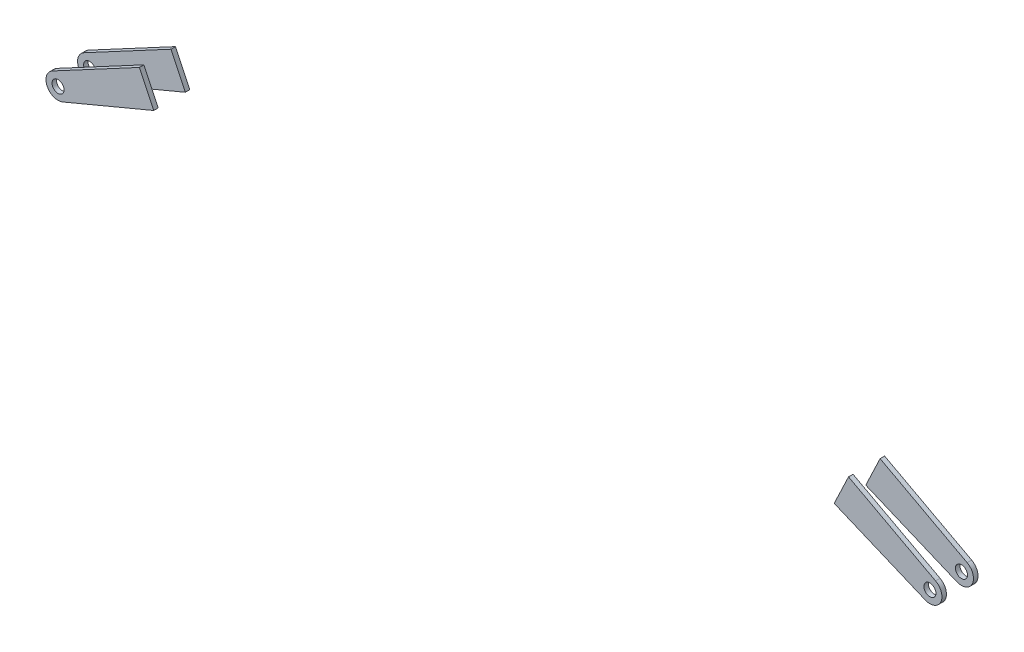
ISO-10303-21;
HEADER;
FILE_DESCRIPTION(('STEP AP214'),'2;1');
FILE_NAME('part.step','',(''),(''),'','','');
FILE_SCHEMA(('AUTOMOTIVE_DESIGN { 1 0 10303 214 1 1 1 1 }'));
ENDSEC;
DATA;
#1=APPLICATION_CONTEXT('core data for automotive mechanical design processes');
#2=APPLICATION_PROTOCOL_DEFINITION('international standard','automotive_design',2000,#1);
#3=PRODUCT_CONTEXT('',#1,'mechanical');
#4=PRODUCT('Part','Part','',(#3));
#5=PRODUCT_RELATED_PRODUCT_CATEGORY('part','',(#4));
#6=PRODUCT_DEFINITION_FORMATION('','',#4);
#7=PRODUCT_DEFINITION_CONTEXT('part definition',#1,'design');
#8=PRODUCT_DEFINITION('design','',#6,#7);
#9=PRODUCT_DEFINITION_SHAPE('','',#8);
#10=(LENGTH_UNIT() NAMED_UNIT(*) SI_UNIT(.MILLI.,.METRE.));
#11=(NAMED_UNIT(*) PLANE_ANGLE_UNIT() SI_UNIT($,.RADIAN.));
#12=(NAMED_UNIT(*) SI_UNIT($,.STERADIAN.) SOLID_ANGLE_UNIT());
#13=UNCERTAINTY_MEASURE_WITH_UNIT(LENGTH_MEASURE(1.E-05),#10,'distance_accuracy_value','');
#14=(GEOMETRIC_REPRESENTATION_CONTEXT(3) GLOBAL_UNCERTAINTY_ASSIGNED_CONTEXT((#13)) GLOBAL_UNIT_ASSIGNED_CONTEXT((#10,
#11,#12)) REPRESENTATION_CONTEXT('',''));
#15=CARTESIAN_POINT('',(0.,0.,0.));
#16=DIRECTION('',(0.,0.,1.));
#17=DIRECTION('',(1.,0.,0.));
#18=AXIS2_PLACEMENT_3D('',#15,#16,#17);
#19=CARTESIAN_POINT('',(0.,0.,152.999999999998));
#20=DIRECTION('',(0.,0.,1.));
#21=DIRECTION('',(1.,0.,0.));
#22=AXIS2_PLACEMENT_3D('',#19,#20,#21);
#23=PLANE('',#22);
#24=CARTESIAN_POINT('',(-290.,-1970.,152.999999999998));
#25=DIRECTION('',(0.,0.,-1.));
#26=DIRECTION('',(-1.,0.,0.));
#27=AXIS2_PLACEMENT_3D('',#24,#25,#26);
#28=CIRCLE('',#27,3.99999999999999);
#29=CARTESIAN_POINT('',(-294.,-1970.,152.999999999998));
#30=VERTEX_POINT('',#29);
#31=EDGE_CURVE('E146',#30,#30,#28,.T.);
#32=ORIENTED_EDGE('',*,*,#31,.F.);
#33=EDGE_LOOP('',(#32));
#34=FACE_BOUND('',#33,.T.);
#35=DIRECTION('',(-0.429568007773573,0.903034510247224,0.));
#36=VECTOR('',#35,1.);
#37=CARTESIAN_POINT('',(-226.339589967334,-1952.00640704133,152.999999999998));
#38=LINE('',#37,#36);
#39=CARTESIAN_POINT('',(-226.339589967334,-1952.00640704133,152.999999999998));
#40=VERTEX_POINT('',#39);
#41=CARTESIAN_POINT('',(-235.87397227063,-1931.96330304391,152.999999999998));
#42=VERTEX_POINT('',#41);
#43=EDGE_CURVE('E132',#40,#42,#38,.T.);
#44=ORIENTED_EDGE('',*,*,#43,.F.);
#45=DIRECTION('',(0.9223450065069,0.386367298010308,0.));
#46=VECTOR('',#45,1.);
#47=CARTESIAN_POINT('',(-286.909061615918,-1977.37876005206,152.999999999998));
#48=LINE('',#47,#46);
#49=CARTESIAN_POINT('',(-286.909061615918,-1977.37876005206,152.999999999998));
#50=VERTEX_POINT('',#49);
#51=EDGE_CURVE('E139',#50,#40,#48,.T.);
#52=ORIENTED_EDGE('',*,*,#51,.F.);
#53=CARTESIAN_POINT('',(-290.,-1970.,152.999999999998));
#54=DIRECTION('',(0.,0.,1.));
#55=DIRECTION('',(-1.,0.,0.));
#56=AXIS2_PLACEMENT_3D('',#53,#54,#55);
#57=CIRCLE('',#56,8.00000000000014);
#58=CARTESIAN_POINT('',(-293.77445464255,-1962.94638446247,152.999999999998));
#59=VERTEX_POINT('',#58);
#60=EDGE_CURVE('E161',#59,#50,#57,.T.);
#61=ORIENTED_EDGE('',*,*,#60,.F.);
#62=DIRECTION('',(-0.881701942191687,-0.47180683031873,0.));
#63=VECTOR('',#62,1.);
#64=CARTESIAN_POINT('',(-235.87397227063,-1931.96330304391,152.999999999998));
#65=LINE('',#64,#63);
#66=EDGE_CURVE('E96',#42,#59,#65,.T.);
#67=ORIENTED_EDGE('',*,*,#66,.F.);
#68=EDGE_LOOP('',(#44,#52,#61,#67));
#69=FACE_BOUND('',#68,.T.);
#70=ADVANCED_FACE('F87',(#34,#69),#23,.F.);
#71=CARTESIAN_POINT('',(0.,0.,155.999999999998));
#72=DIRECTION('',(0.,0.,1.));
#73=DIRECTION('',(1.,0.,0.));
#74=AXIS2_PLACEMENT_3D('',#71,#72,#73);
#75=PLANE('',#74);
#76=CARTESIAN_POINT('',(-290.,-1970.,155.999999999998));
#77=DIRECTION('',(0.,0.,-1.));
#78=DIRECTION('',(-1.,0.,0.));
#79=AXIS2_PLACEMENT_3D('',#76,#77,#78);
#80=CIRCLE('',#79,3.99999999999999);
#81=CARTESIAN_POINT('',(-294.,-1970.,155.999999999998));
#82=VERTEX_POINT('',#81);
#83=EDGE_CURVE('E149',#82,#82,#80,.T.);
#84=ORIENTED_EDGE('',*,*,#83,.T.);
#85=EDGE_LOOP('',(#84));
#86=FACE_BOUND('',#85,.T.);
#87=DIRECTION('',(-0.429568007773573,0.903034510247224,0.));
#88=VECTOR('',#87,1.);
#89=CARTESIAN_POINT('',(-226.339589967334,-1952.00640704133,155.999999999998));
#90=LINE('',#89,#88);
#91=CARTESIAN_POINT('',(-226.339589967334,-1952.00640704133,155.999999999998));
#92=VERTEX_POINT('',#91);
#93=CARTESIAN_POINT('',(-235.87397227063,-1931.96330304391,155.999999999998));
#94=VERTEX_POINT('',#93);
#95=EDGE_CURVE('E134',#92,#94,#90,.T.);
#96=ORIENTED_EDGE('',*,*,#95,.T.);
#97=DIRECTION('',(-0.881701942191687,-0.47180683031873,0.));
#98=VECTOR('',#97,1.);
#99=CARTESIAN_POINT('',(-235.87397227063,-1931.96330304391,155.999999999998));
#100=LINE('',#99,#98);
#101=CARTESIAN_POINT('',(-293.77445464255,-1962.94638446247,155.999999999998));
#102=VERTEX_POINT('',#101);
#103=EDGE_CURVE('E13',#94,#102,#100,.T.);
#104=ORIENTED_EDGE('',*,*,#103,.T.);
#105=CARTESIAN_POINT('',(-290.,-1970.,155.999999999998));
#106=DIRECTION('',(0.,0.,1.));
#107=DIRECTION('',(-1.,0.,0.));
#108=AXIS2_PLACEMENT_3D('',#105,#106,#107);
#109=CIRCLE('',#108,8.00000000000014);
#110=CARTESIAN_POINT('',(-286.909061615918,-1977.37876005206,155.999999999998));
#111=VERTEX_POINT('',#110);
#112=EDGE_CURVE('E158',#102,#111,#109,.T.);
#113=ORIENTED_EDGE('',*,*,#112,.T.);
#114=DIRECTION('',(0.9223450065069,0.386367298010308,0.));
#115=VECTOR('',#114,1.);
#116=CARTESIAN_POINT('',(-286.909061615918,-1977.37876005206,155.999999999998));
#117=LINE('',#116,#115);
#118=EDGE_CURVE('E163',#111,#92,#117,.T.);
#119=ORIENTED_EDGE('',*,*,#118,.T.);
#120=EDGE_LOOP('',(#96,#104,#113,#119));
#121=FACE_BOUND('',#120,.T.);
#122=ADVANCED_FACE('F175',(#86,#121),#75,.T.);
#123=CARTESIAN_POINT('',(-226.339589967334,-1952.00640704133,155.999999999998));
#124=DIRECTION('',(-0.903034510247224,-0.429568007773573,0.));
#125=DIRECTION('',(-0.429568007773573,0.903034510247224,0.));
#126=AXIS2_PLACEMENT_3D('',#123,#124,#125);
#127=PLANE('',#126);
#128=ORIENTED_EDGE('',*,*,#43,.T.);
#129=DIRECTION('',(0.,0.,-1.));
#130=VECTOR('',#129,1.);
#131=CARTESIAN_POINT('',(-235.87397227063,-1931.96330304391,155.999999999998));
#132=LINE('',#131,#130);
#133=EDGE_CURVE('E122',#94,#42,#132,.T.);
#134=ORIENTED_EDGE('',*,*,#133,.F.);
#135=ORIENTED_EDGE('',*,*,#95,.F.);
#136=DIRECTION('',(0.,0.,-1.));
#137=VECTOR('',#136,1.);
#138=CARTESIAN_POINT('',(-226.339589967334,-1952.00640704133,155.999999999998));
#139=LINE('',#138,#137);
#140=EDGE_CURVE('E128',#92,#40,#139,.T.);
#141=ORIENTED_EDGE('',*,*,#140,.T.);
#142=EDGE_LOOP('',(#128,#134,#135,#141));
#143=FACE_BOUND('',#142,.T.);
#144=ADVANCED_FACE('F130',(#143),#127,.F.);
#145=CARTESIAN_POINT('',(-286.909061615918,-1977.37876005206,155.999999999998));
#146=DIRECTION('',(-0.386367298010308,0.9223450065069,0.));
#147=DIRECTION('',(0.9223450065069,0.386367298010308,0.));
#148=AXIS2_PLACEMENT_3D('',#145,#146,#147);
#149=PLANE('',#148);
#150=ORIENTED_EDGE('',*,*,#51,.T.);
#151=ORIENTED_EDGE('',*,*,#140,.F.);
#152=ORIENTED_EDGE('',*,*,#118,.F.);
#153=DIRECTION('',(0.,0.,-1.));
#154=VECTOR('',#153,1.);
#155=CARTESIAN_POINT('',(-286.909061615918,-1977.37876005206,155.999999999998));
#156=LINE('',#155,#154);
#157=EDGE_CURVE('E141',#111,#50,#156,.T.);
#158=ORIENTED_EDGE('',*,*,#157,.T.);
#159=EDGE_LOOP('',(#150,#151,#152,#158));
#160=FACE_BOUND('',#159,.T.);
#161=ADVANCED_FACE('F140',(#160),#149,.F.);
#162=CARTESIAN_POINT('',(-290.,-1970.,155.999999999998));
#163=DIRECTION('',(0.,0.,-1.));
#164=DIRECTION('',(-1.,0.,0.));
#165=AXIS2_PLACEMENT_3D('',#162,#163,#164);
#166=CYLINDRICAL_SURFACE('',#165,8.00000000000014);
#167=ORIENTED_EDGE('',*,*,#60,.T.);
#168=ORIENTED_EDGE('',*,*,#157,.F.);
#169=ORIENTED_EDGE('',*,*,#112,.F.);
#170=DIRECTION('',(0.,0.,-1.));
#171=VECTOR('',#170,1.);
#172=CARTESIAN_POINT('',(-293.77445464255,-1962.94638446247,155.999999999998));
#173=LINE('',#172,#171);
#174=EDGE_CURVE('E105',#102,#59,#173,.T.);
#175=ORIENTED_EDGE('',*,*,#174,.T.);
#176=EDGE_LOOP('',(#167,#168,#169,#175));
#177=FACE_BOUND('',#176,.T.);
#178=ADVANCED_FACE('F211',(#177),#166,.T.);
#179=CARTESIAN_POINT('',(-235.87397227063,-1931.96330304391,155.999999999998));
#180=DIRECTION('',(0.47180683031873,-0.881701942191687,0.));
#181=DIRECTION('',(-0.881701942191687,-0.47180683031873,0.));
#182=AXIS2_PLACEMENT_3D('',#179,#180,#181);
#183=PLANE('',#182);
#184=ORIENTED_EDGE('',*,*,#66,.T.);
#185=ORIENTED_EDGE('',*,*,#174,.F.);
#186=ORIENTED_EDGE('',*,*,#103,.F.);
#187=ORIENTED_EDGE('',*,*,#133,.T.);
#188=EDGE_LOOP('',(#184,#185,#186,#187));
#189=FACE_BOUND('',#188,.T.);
#190=ADVANCED_FACE('F196',(#189),#183,.F.);
#191=CARTESIAN_POINT('',(-290.,-1970.,155.999999999998));
#192=DIRECTION('',(0.,0.,-1.));
#193=DIRECTION('',(-1.,0.,0.));
#194=AXIS2_PLACEMENT_3D('',#191,#192,#193);
#195=CYLINDRICAL_SURFACE('',#194,3.99999999999999);
#196=ORIENTED_EDGE('',*,*,#83,.F.);
#197=EDGE_LOOP('',(#196));
#198=FACE_BOUND('',#197,.T.);
#199=ORIENTED_EDGE('',*,*,#31,.T.);
#200=EDGE_LOOP('',(#199));
#201=FACE_BOUND('',#200,.T.);
#202=ADVANCED_FACE('F193',(#198,#201),#195,.F.);
#203=CLOSED_SHELL('',(#70,#122,#144,#161,#178,#190,#202));
#204=MANIFOLD_SOLID_BREP('B2',#203);
#205=CARTESIAN_POINT('',(0.,0.,176.999999999998));
#206=DIRECTION('',(0.,0.,-1.));
#207=DIRECTION('',(1.,0.,0.));
#208=AXIS2_PLACEMENT_3D('',#205,#206,#207);
#209=PLANE('',#208);
#210=CARTESIAN_POINT('',(-290.,-1970.,176.999999999998));
#211=DIRECTION('',(0.,0.,-1.));
#212=DIRECTION('',(-1.,0.,0.));
#213=AXIS2_PLACEMENT_3D('',#210,#211,#212);
#214=CIRCLE('',#213,3.99999999999999);
#215=CARTESIAN_POINT('',(-294.,-1970.,176.999999999998));
#216=VERTEX_POINT('',#215);
#217=EDGE_CURVE('E325',#216,#216,#214,.T.);
#218=ORIENTED_EDGE('',*,*,#217,.T.);
#219=EDGE_LOOP('',(#218));
#220=FACE_BOUND('',#219,.T.);
#221=DIRECTION('',(-0.429568007773573,0.903034510247224,0.));
#222=VECTOR('',#221,1.);
#223=CARTESIAN_POINT('',(-226.339589967334,-1952.00640704133,176.999999999998));
#224=LINE('',#223,#222);
#225=CARTESIAN_POINT('',(-226.339589967334,-1952.00640704133,176.999999999998));
#226=VERTEX_POINT('',#225);
#227=CARTESIAN_POINT('',(-235.87397227063,-1931.96330304391,176.999999999998));
#228=VERTEX_POINT('',#227);
#229=EDGE_CURVE('E317',#226,#228,#224,.T.);
#230=ORIENTED_EDGE('',*,*,#229,.T.);
#231=DIRECTION('',(-0.881701942191687,-0.47180683031873,0.));
#232=VECTOR('',#231,1.);
#233=CARTESIAN_POINT('',(-235.87397227063,-1931.96330304391,176.999999999998));
#234=LINE('',#233,#232);
#235=CARTESIAN_POINT('',(-293.77445464255,-1962.94638446247,176.999999999998));
#236=VERTEX_POINT('',#235);
#237=EDGE_CURVE('E274',#228,#236,#234,.T.);
#238=ORIENTED_EDGE('',*,*,#237,.T.);
#239=CARTESIAN_POINT('',(-290.,-1970.,176.999999999998));
#240=DIRECTION('',(0.,0.,1.));
#241=DIRECTION('',(-1.,0.,0.));
#242=AXIS2_PLACEMENT_3D('',#239,#240,#241);
#243=CIRCLE('',#242,8.00000000000014);
#244=CARTESIAN_POINT('',(-286.909061615918,-1977.37876005206,176.999999999998));
#245=VERTEX_POINT('',#244);
#246=EDGE_CURVE('E321',#236,#245,#243,.T.);
#247=ORIENTED_EDGE('',*,*,#246,.T.);
#248=DIRECTION('',(0.9223450065069,0.386367298010308,0.));
#249=VECTOR('',#248,1.);
#250=CARTESIAN_POINT('',(-286.909061615918,-1977.37876005206,176.999999999998));
#251=LINE('',#250,#249);
#252=EDGE_CURVE('E311',#245,#226,#251,.T.);
#253=ORIENTED_EDGE('',*,*,#252,.T.);
#254=EDGE_LOOP('',(#230,#238,#247,#253));
#255=FACE_BOUND('',#254,.T.);
#256=ADVANCED_FACE('F265',(#220,#255),#209,.F.);
#257=CARTESIAN_POINT('',(0.,0.,173.999999999998));
#258=DIRECTION('',(0.,0.,-1.));
#259=DIRECTION('',(1.,0.,0.));
#260=AXIS2_PLACEMENT_3D('',#257,#258,#259);
#261=PLANE('',#260);
#262=CARTESIAN_POINT('',(-290.,-1970.,173.999999999998));
#263=DIRECTION('',(0.,0.,-1.));
#264=DIRECTION('',(-1.,0.,0.));
#265=AXIS2_PLACEMENT_3D('',#262,#263,#264);
#266=CIRCLE('',#265,3.99999999999999);
#267=CARTESIAN_POINT('',(-294.,-1970.,173.999999999998));
#268=VERTEX_POINT('',#267);
#269=EDGE_CURVE('E328',#268,#268,#266,.T.);
#270=ORIENTED_EDGE('',*,*,#269,.F.);
#271=EDGE_LOOP('',(#270));
#272=FACE_BOUND('',#271,.T.);
#273=DIRECTION('',(-0.429568007773573,0.903034510247224,0.));
#274=VECTOR('',#273,1.);
#275=CARTESIAN_POINT('',(-226.339589967334,-1952.00640704133,173.999999999998));
#276=LINE('',#275,#274);
#277=CARTESIAN_POINT('',(-226.339589967334,-1952.00640704133,173.999999999998));
#278=VERTEX_POINT('',#277);
#279=CARTESIAN_POINT('',(-235.87397227063,-1931.96330304391,173.999999999998));
#280=VERTEX_POINT('',#279);
#281=EDGE_CURVE('E316',#278,#280,#276,.T.);
#282=ORIENTED_EDGE('',*,*,#281,.F.);
#283=DIRECTION('',(0.9223450065069,0.386367298010308,0.));
#284=VECTOR('',#283,1.);
#285=CARTESIAN_POINT('',(-286.909061615918,-1977.37876005206,173.999999999998));
#286=LINE('',#285,#284);
#287=CARTESIAN_POINT('',(-286.909061615918,-1977.37876005206,173.999999999998));
#288=VERTEX_POINT('',#287);
#289=EDGE_CURVE('E314',#288,#278,#286,.T.);
#290=ORIENTED_EDGE('',*,*,#289,.F.);
#291=CARTESIAN_POINT('',(-290.,-1970.,173.999999999998));
#292=DIRECTION('',(0.,0.,1.));
#293=DIRECTION('',(-1.,0.,0.));
#294=AXIS2_PLACEMENT_3D('',#291,#292,#293);
#295=CIRCLE('',#294,8.00000000000014);
#296=CARTESIAN_POINT('',(-293.77445464255,-1962.94638446247,173.999999999998));
#297=VERTEX_POINT('',#296);
#298=EDGE_CURVE('E337',#297,#288,#295,.T.);
#299=ORIENTED_EDGE('',*,*,#298,.F.);
#300=DIRECTION('',(-0.881701942191687,-0.47180683031873,0.));
#301=VECTOR('',#300,1.);
#302=CARTESIAN_POINT('',(-235.87397227063,-1931.96330304391,173.999999999998));
#303=LINE('',#302,#301);
#304=EDGE_CURVE('E85',#280,#297,#303,.T.);
#305=ORIENTED_EDGE('',*,*,#304,.F.);
#306=EDGE_LOOP('',(#282,#290,#299,#305));
#307=FACE_BOUND('',#306,.T.);
#308=ADVANCED_FACE('F354',(#272,#307),#261,.T.);
#309=CARTESIAN_POINT('',(-226.339589967334,-1952.00640704133,173.999999999998));
#310=DIRECTION('',(-0.903034510247224,-0.429568007773573,0.));
#311=DIRECTION('',(-0.429568007773573,0.903034510247224,0.));
#312=AXIS2_PLACEMENT_3D('',#309,#310,#311);
#313=PLANE('',#312);
#314=ORIENTED_EDGE('',*,*,#229,.F.);
#315=DIRECTION('',(0.,0.,1.));
#316=VECTOR('',#315,1.);
#317=CARTESIAN_POINT('',(-226.339589967334,-1952.00640704133,173.999999999998));
#318=LINE('',#317,#316);
#319=EDGE_CURVE('E308',#278,#226,#318,.T.);
#320=ORIENTED_EDGE('',*,*,#319,.F.);
#321=ORIENTED_EDGE('',*,*,#281,.T.);
#322=DIRECTION('',(0.,0.,1.));
#323=VECTOR('',#322,1.);
#324=CARTESIAN_POINT('',(-235.87397227063,-1931.96330304391,173.999999999998));
#325=LINE('',#324,#323);
#326=EDGE_CURVE('E302',#280,#228,#325,.T.);
#327=ORIENTED_EDGE('',*,*,#326,.T.);
#328=EDGE_LOOP('',(#314,#320,#321,#327));
#329=FACE_BOUND('',#328,.T.);
#330=ADVANCED_FACE('F324',(#329),#313,.F.);
#331=CARTESIAN_POINT('',(-286.909061615918,-1977.37876005206,173.999999999998));
#332=DIRECTION('',(-0.386367298010308,0.9223450065069,0.));
#333=DIRECTION('',(0.9223450065069,0.386367298010308,0.));
#334=AXIS2_PLACEMENT_3D('',#331,#332,#333);
#335=PLANE('',#334);
#336=ORIENTED_EDGE('',*,*,#252,.F.);
#337=DIRECTION('',(0.,0.,1.));
#338=VECTOR('',#337,1.);
#339=CARTESIAN_POINT('',(-286.909061615918,-1977.37876005206,173.999999999998));
#340=LINE('',#339,#338);
#341=EDGE_CURVE('E322',#288,#245,#340,.T.);
#342=ORIENTED_EDGE('',*,*,#341,.F.);
#343=ORIENTED_EDGE('',*,*,#289,.T.);
#344=ORIENTED_EDGE('',*,*,#319,.T.);
#345=EDGE_LOOP('',(#336,#342,#343,#344));
#346=FACE_BOUND('',#345,.T.);
#347=ADVANCED_FACE('F310',(#346),#335,.F.);
#348=CARTESIAN_POINT('',(-290.,-1970.,173.999999999998));
#349=DIRECTION('',(0.,0.,1.));
#350=DIRECTION('',(-1.,0.,0.));
#351=AXIS2_PLACEMENT_3D('',#348,#349,#350);
#352=CYLINDRICAL_SURFACE('',#351,8.00000000000014);
#353=ORIENTED_EDGE('',*,*,#246,.F.);
#354=DIRECTION('',(0.,0.,1.));
#355=VECTOR('',#354,1.);
#356=CARTESIAN_POINT('',(-293.77445464255,-1962.94638446247,173.999999999998));
#357=LINE('',#356,#355);
#358=EDGE_CURVE('E283',#297,#236,#357,.T.);
#359=ORIENTED_EDGE('',*,*,#358,.F.);
#360=ORIENTED_EDGE('',*,*,#298,.T.);
#361=ORIENTED_EDGE('',*,*,#341,.T.);
#362=EDGE_LOOP('',(#353,#359,#360,#361));
#363=FACE_BOUND('',#362,.T.);
#364=ADVANCED_FACE('F350',(#363),#352,.T.);
#365=CARTESIAN_POINT('',(-235.87397227063,-1931.96330304391,173.999999999998));
#366=DIRECTION('',(0.47180683031873,-0.881701942191687,0.));
#367=DIRECTION('',(-0.881701942191687,-0.47180683031873,0.));
#368=AXIS2_PLACEMENT_3D('',#365,#366,#367);
#369=PLANE('',#368);
#370=ORIENTED_EDGE('',*,*,#237,.F.);
#371=ORIENTED_EDGE('',*,*,#326,.F.);
#372=ORIENTED_EDGE('',*,*,#304,.T.);
#373=ORIENTED_EDGE('',*,*,#358,.T.);
#374=EDGE_LOOP('',(#370,#371,#372,#373));
#375=FACE_BOUND('',#374,.T.);
#376=ADVANCED_FACE('F367',(#375),#369,.F.);
#377=CARTESIAN_POINT('',(-290.,-1970.,173.999999999998));
#378=DIRECTION('',(0.,0.,1.));
#379=DIRECTION('',(-1.,0.,0.));
#380=AXIS2_PLACEMENT_3D('',#377,#378,#379);
#381=CYLINDRICAL_SURFACE('',#380,3.99999999999999);
#382=ORIENTED_EDGE('',*,*,#269,.T.);
#383=EDGE_LOOP('',(#382));
#384=FACE_BOUND('',#383,.T.);
#385=ORIENTED_EDGE('',*,*,#217,.F.);
#386=EDGE_LOOP('',(#385));
#387=FACE_BOUND('',#386,.T.);
#388=ADVANCED_FACE('F369',(#384,#387),#381,.F.);
#389=CLOSED_SHELL('',(#256,#308,#330,#347,#364,#376,#388));
#390=MANIFOLD_SOLID_BREP('B7',#389);
#391=CARTESIAN_POINT('',(0.,0.,152.999999999998));
#392=DIRECTION('',(0.,0.,1.));
#393=DIRECTION('',(-1.,0.,0.));
#394=AXIS2_PLACEMENT_3D('',#391,#392,#393);
#395=PLANE('',#394);
#396=CARTESIAN_POINT('',(290.,-1970.,152.999999999998));
#397=DIRECTION('',(0.,0.,1.));
#398=DIRECTION('',(1.,0.,0.));
#399=AXIS2_PLACEMENT_3D('',#396,#397,#398);
#400=CIRCLE('',#399,3.99999999999999);
#401=CARTESIAN_POINT('',(294.,-1970.,152.999999999998));
#402=VERTEX_POINT('',#401);
#403=EDGE_CURVE('E502',#402,#402,#400,.T.);
#404=ORIENTED_EDGE('',*,*,#403,.T.);
#405=EDGE_LOOP('',(#404));
#406=FACE_BOUND('',#405,.T.);
#407=DIRECTION('',(0.429568007773573,0.903034510247224,0.));
#408=VECTOR('',#407,1.);
#409=CARTESIAN_POINT('',(226.339589967334,-1952.00640704133,152.999999999998));
#410=LINE('',#409,#408);
#411=CARTESIAN_POINT('',(226.339589967334,-1952.00640704133,152.999999999998));
#412=VERTEX_POINT('',#411);
#413=CARTESIAN_POINT('',(235.87397227063,-1931.96330304391,152.999999999998));
#414=VERTEX_POINT('',#413);
#415=EDGE_CURVE('E494',#412,#414,#410,.T.);
#416=ORIENTED_EDGE('',*,*,#415,.T.);
#417=DIRECTION('',(0.881701942191687,-0.47180683031873,0.));
#418=VECTOR('',#417,1.);
#419=CARTESIAN_POINT('',(235.87397227063,-1931.96330304391,152.999999999998));
#420=LINE('',#419,#418);
#421=CARTESIAN_POINT('',(293.77445464255,-1962.94638446247,152.999999999998));
#422=VERTEX_POINT('',#421);
#423=EDGE_CURVE('E451',#414,#422,#420,.T.);
#424=ORIENTED_EDGE('',*,*,#423,.T.);
#425=CARTESIAN_POINT('',(290.,-1970.,152.999999999998));
#426=DIRECTION('',(0.,0.,-1.));
#427=DIRECTION('',(1.,0.,0.));
#428=AXIS2_PLACEMENT_3D('',#425,#426,#427);
#429=CIRCLE('',#428,8.00000000000014);
#430=CARTESIAN_POINT('',(286.909061615918,-1977.37876005206,152.999999999998));
#431=VERTEX_POINT('',#430);
#432=EDGE_CURVE('E498',#422,#431,#429,.T.);
#433=ORIENTED_EDGE('',*,*,#432,.T.);
#434=DIRECTION('',(-0.9223450065069,0.386367298010308,0.));
#435=VECTOR('',#434,1.);
#436=CARTESIAN_POINT('',(286.909061615918,-1977.37876005206,152.999999999998));
#437=LINE('',#436,#435);
#438=EDGE_CURVE('E488',#431,#412,#437,.T.);
#439=ORIENTED_EDGE('',*,*,#438,.T.);
#440=EDGE_LOOP('',(#416,#424,#433,#439));
#441=FACE_BOUND('',#440,.T.);
#442=ADVANCED_FACE('F442',(#406,#441),#395,.F.);
#443=CARTESIAN_POINT('',(0.,0.,155.999999999998));
#444=DIRECTION('',(0.,0.,1.));
#445=DIRECTION('',(-1.,0.,0.));
#446=AXIS2_PLACEMENT_3D('',#443,#444,#445);
#447=PLANE('',#446);
#448=CARTESIAN_POINT('',(290.,-1970.,155.999999999998));
#449=DIRECTION('',(0.,0.,1.));
#450=DIRECTION('',(1.,0.,0.));
#451=AXIS2_PLACEMENT_3D('',#448,#449,#450);
#452=CIRCLE('',#451,3.99999999999999);
#453=CARTESIAN_POINT('',(294.,-1970.,155.999999999998));
#454=VERTEX_POINT('',#453);
#455=EDGE_CURVE('E505',#454,#454,#452,.T.);
#456=ORIENTED_EDGE('',*,*,#455,.F.);
#457=EDGE_LOOP('',(#456));
#458=FACE_BOUND('',#457,.T.);
#459=DIRECTION('',(0.429568007773573,0.903034510247224,0.));
#460=VECTOR('',#459,1.);
#461=CARTESIAN_POINT('',(226.339589967334,-1952.00640704133,155.999999999998));
#462=LINE('',#461,#460);
#463=CARTESIAN_POINT('',(226.339589967334,-1952.00640704133,155.999999999998));
#464=VERTEX_POINT('',#463);
#465=CARTESIAN_POINT('',(235.87397227063,-1931.96330304391,155.999999999998));
#466=VERTEX_POINT('',#465);
#467=EDGE_CURVE('E493',#464,#466,#462,.T.);
#468=ORIENTED_EDGE('',*,*,#467,.F.);
#469=DIRECTION('',(-0.9223450065069,0.386367298010308,0.));
#470=VECTOR('',#469,1.);
#471=CARTESIAN_POINT('',(286.909061615918,-1977.37876005206,155.999999999998));
#472=LINE('',#471,#470);
#473=CARTESIAN_POINT('',(286.909061615918,-1977.37876005206,155.999999999998));
#474=VERTEX_POINT('',#473);
#475=EDGE_CURVE('E491',#474,#464,#472,.T.);
#476=ORIENTED_EDGE('',*,*,#475,.F.);
#477=CARTESIAN_POINT('',(290.,-1970.,155.999999999998));
#478=DIRECTION('',(0.,0.,-1.));
#479=DIRECTION('',(1.,0.,0.));
#480=AXIS2_PLACEMENT_3D('',#477,#478,#479);
#481=CIRCLE('',#480,8.00000000000014);
#482=CARTESIAN_POINT('',(293.77445464255,-1962.94638446247,155.999999999998));
#483=VERTEX_POINT('',#482);
#484=EDGE_CURVE('E514',#483,#474,#481,.T.);
#485=ORIENTED_EDGE('',*,*,#484,.F.);
#486=DIRECTION('',(0.881701942191687,-0.47180683031873,0.));
#487=VECTOR('',#486,1.);
#488=CARTESIAN_POINT('',(235.87397227063,-1931.96330304391,155.999999999998));
#489=LINE('',#488,#487);
#490=EDGE_CURVE('E263',#466,#483,#489,.T.);
#491=ORIENTED_EDGE('',*,*,#490,.F.);
#492=EDGE_LOOP('',(#468,#476,#485,#491));
#493=FACE_BOUND('',#492,.T.);
#494=ADVANCED_FACE('F531',(#458,#493),#447,.T.);
#495=CARTESIAN_POINT('',(226.339589967334,-1952.00640704133,155.999999999998));
#496=DIRECTION('',(0.903034510247224,-0.429568007773573,0.));
#497=DIRECTION('',(0.429568007773573,0.903034510247224,0.));
#498=AXIS2_PLACEMENT_3D('',#495,#496,#497);
#499=PLANE('',#498);
#500=ORIENTED_EDGE('',*,*,#415,.F.);
#501=DIRECTION('',(0.,0.,-1.));
#502=VECTOR('',#501,1.);
#503=CARTESIAN_POINT('',(226.339589967334,-1952.00640704133,155.999999999998));
#504=LINE('',#503,#502);
#505=EDGE_CURVE('E485',#464,#412,#504,.T.);
#506=ORIENTED_EDGE('',*,*,#505,.F.);
#507=ORIENTED_EDGE('',*,*,#467,.T.);
#508=DIRECTION('',(0.,0.,-1.));
#509=VECTOR('',#508,1.);
#510=CARTESIAN_POINT('',(235.87397227063,-1931.96330304391,155.999999999998));
#511=LINE('',#510,#509);
#512=EDGE_CURVE('E479',#466,#414,#511,.T.);
#513=ORIENTED_EDGE('',*,*,#512,.T.);
#514=EDGE_LOOP('',(#500,#506,#507,#513));
#515=FACE_BOUND('',#514,.T.);
#516=ADVANCED_FACE('F501',(#515),#499,.F.);
#517=CARTESIAN_POINT('',(286.909061615918,-1977.37876005206,155.999999999998));
#518=DIRECTION('',(0.386367298010308,0.9223450065069,0.));
#519=DIRECTION('',(-0.9223450065069,0.386367298010308,0.));
#520=AXIS2_PLACEMENT_3D('',#517,#518,#519);
#521=PLANE('',#520);
#522=ORIENTED_EDGE('',*,*,#438,.F.);
#523=DIRECTION('',(0.,0.,-1.));
#524=VECTOR('',#523,1.);
#525=CARTESIAN_POINT('',(286.909061615918,-1977.37876005206,155.999999999998));
#526=LINE('',#525,#524);
#527=EDGE_CURVE('E499',#474,#431,#526,.T.);
#528=ORIENTED_EDGE('',*,*,#527,.F.);
#529=ORIENTED_EDGE('',*,*,#475,.T.);
#530=ORIENTED_EDGE('',*,*,#505,.T.);
#531=EDGE_LOOP('',(#522,#528,#529,#530));
#532=FACE_BOUND('',#531,.T.);
#533=ADVANCED_FACE('F487',(#532),#521,.F.);
#534=CARTESIAN_POINT('',(290.,-1970.,155.999999999998));
#535=DIRECTION('',(0.,0.,-1.));
#536=DIRECTION('',(1.,0.,0.));
#537=AXIS2_PLACEMENT_3D('',#534,#535,#536);
#538=CYLINDRICAL_SURFACE('',#537,8.00000000000014);
#539=ORIENTED_EDGE('',*,*,#432,.F.);
#540=DIRECTION('',(0.,0.,-1.));
#541=VECTOR('',#540,1.);
#542=CARTESIAN_POINT('',(293.77445464255,-1962.94638446247,155.999999999998));
#543=LINE('',#542,#541);
#544=EDGE_CURVE('E460',#483,#422,#543,.T.);
#545=ORIENTED_EDGE('',*,*,#544,.F.);
#546=ORIENTED_EDGE('',*,*,#484,.T.);
#547=ORIENTED_EDGE('',*,*,#527,.T.);
#548=EDGE_LOOP('',(#539,#545,#546,#547));
#549=FACE_BOUND('',#548,.T.);
#550=ADVANCED_FACE('F527',(#549),#538,.T.);
#551=CARTESIAN_POINT('',(235.87397227063,-1931.96330304391,155.999999999998));
#552=DIRECTION('',(-0.47180683031873,-0.881701942191687,0.));
#553=DIRECTION('',(0.881701942191687,-0.47180683031873,0.));
#554=AXIS2_PLACEMENT_3D('',#551,#552,#553);
#555=PLANE('',#554);
#556=ORIENTED_EDGE('',*,*,#423,.F.);
#557=ORIENTED_EDGE('',*,*,#512,.F.);
#558=ORIENTED_EDGE('',*,*,#490,.T.);
#559=ORIENTED_EDGE('',*,*,#544,.T.);
#560=EDGE_LOOP('',(#556,#557,#558,#559));
#561=FACE_BOUND('',#560,.T.);
#562=ADVANCED_FACE('F544',(#561),#555,.F.);
#563=CARTESIAN_POINT('',(290.,-1970.,155.999999999998));
#564=DIRECTION('',(0.,0.,-1.));
#565=DIRECTION('',(1.,0.,0.));
#566=AXIS2_PLACEMENT_3D('',#563,#564,#565);
#567=CYLINDRICAL_SURFACE('',#566,3.99999999999999);
#568=ORIENTED_EDGE('',*,*,#455,.T.);
#569=EDGE_LOOP('',(#568));
#570=FACE_BOUND('',#569,.T.);
#571=ORIENTED_EDGE('',*,*,#403,.F.);
#572=EDGE_LOOP('',(#571));
#573=FACE_BOUND('',#572,.T.);
#574=ADVANCED_FACE('F546',(#570,#573),#567,.F.);
#575=CLOSED_SHELL('',(#442,#494,#516,#533,#550,#562,#574));
#576=MANIFOLD_SOLID_BREP('B79',#575);
#577=CARTESIAN_POINT('',(0.,0.,176.999999999998));
#578=DIRECTION('',(0.,0.,-1.));
#579=DIRECTION('',(-1.,0.,0.));
#580=AXIS2_PLACEMENT_3D('',#577,#578,#579);
#581=PLANE('',#580);
#582=CARTESIAN_POINT('',(290.,-1970.,176.999999999998));
#583=DIRECTION('',(0.,0.,1.));
#584=DIRECTION('',(1.,0.,0.));
#585=AXIS2_PLACEMENT_3D('',#582,#583,#584);
#586=CIRCLE('',#585,3.99999999999999);
#587=CARTESIAN_POINT('',(294.,-1970.,176.999999999998));
#588=VERTEX_POINT('',#587);
#589=EDGE_CURVE('E670',#588,#588,#586,.T.);
#590=ORIENTED_EDGE('',*,*,#589,.F.);
#591=EDGE_LOOP('',(#590));
#592=FACE_BOUND('',#591,.T.);
#593=DIRECTION('',(0.429568007773573,0.903034510247224,0.));
#594=VECTOR('',#593,1.);
#595=CARTESIAN_POINT('',(226.339589967334,-1952.00640704133,176.999999999998));
#596=LINE('',#595,#594);
#597=CARTESIAN_POINT('',(226.339589967334,-1952.00640704133,176.999999999998));
#598=VERTEX_POINT('',#597);
#599=CARTESIAN_POINT('',(235.87397227063,-1931.96330304391,176.999999999998));
#600=VERTEX_POINT('',#599);
#601=EDGE_CURVE('E650',#598,#600,#596,.T.);
#602=ORIENTED_EDGE('',*,*,#601,.F.);
#603=DIRECTION('',(-0.9223450065069,0.386367298010308,0.));
#604=VECTOR('',#603,1.);
#605=CARTESIAN_POINT('',(286.909061615918,-1977.37876005206,176.999999999998));
#606=LINE('',#605,#604);
#607=CARTESIAN_POINT('',(286.909061615918,-1977.37876005206,176.999999999998));
#608=VERTEX_POINT('',#607);
#609=EDGE_CURVE('E657',#608,#598,#606,.T.);
#610=ORIENTED_EDGE('',*,*,#609,.F.);
#611=CARTESIAN_POINT('',(290.,-1970.,176.999999999998));
#612=DIRECTION('',(0.,0.,-1.));
#613=DIRECTION('',(1.,0.,0.));
#614=AXIS2_PLACEMENT_3D('',#611,#612,#613);
#615=CIRCLE('',#614,8.00000000000014);
#616=CARTESIAN_POINT('',(293.77445464255,-1962.94638446247,176.999999999998));
#617=VERTEX_POINT('',#616);
#618=EDGE_CURVE('E684',#617,#608,#615,.T.);
#619=ORIENTED_EDGE('',*,*,#618,.F.);
#620=DIRECTION('',(0.881701942191687,-0.47180683031873,0.));
#621=VECTOR('',#620,1.);
#622=CARTESIAN_POINT('',(235.87397227063,-1931.96330304391,176.999999999998));
#623=LINE('',#622,#621);
#624=EDGE_CURVE('E619',#600,#617,#623,.T.);
#625=ORIENTED_EDGE('',*,*,#624,.F.);
#626=EDGE_LOOP('',(#602,#610,#619,#625));
#627=FACE_BOUND('',#626,.T.);
#628=ADVANCED_FACE('F610',(#592,#627),#581,.F.);
#629=CARTESIAN_POINT('',(0.,0.,173.999999999998));
#630=DIRECTION('',(0.,0.,-1.));
#631=DIRECTION('',(-1.,0.,0.));
#632=AXIS2_PLACEMENT_3D('',#629,#630,#631);
#633=PLANE('',#632);
#634=CARTESIAN_POINT('',(290.,-1970.,173.999999999998));
#635=DIRECTION('',(0.,0.,1.));
#636=DIRECTION('',(1.,0.,0.));
#637=AXIS2_PLACEMENT_3D('',#634,#635,#636);
#638=CIRCLE('',#637,3.99999999999999);
#639=CARTESIAN_POINT('',(294.,-1970.,173.999999999998));
#640=VERTEX_POINT('',#639);
#641=EDGE_CURVE('E673',#640,#640,#638,.T.);
#642=ORIENTED_EDGE('',*,*,#641,.T.);
#643=EDGE_LOOP('',(#642));
#644=FACE_BOUND('',#643,.T.);
#645=DIRECTION('',(0.429568007773573,0.903034510247224,0.));
#646=VECTOR('',#645,1.);
#647=CARTESIAN_POINT('',(226.339589967334,-1952.00640704133,173.999999999998));
#648=LINE('',#647,#646);
#649=CARTESIAN_POINT('',(226.339589967334,-1952.00640704133,173.999999999998));
#650=VERTEX_POINT('',#649);
#651=CARTESIAN_POINT('',(235.87397227063,-1931.96330304391,173.999999999998));
#652=VERTEX_POINT('',#651);
#653=EDGE_CURVE('E668',#650,#652,#648,.T.);
#654=ORIENTED_EDGE('',*,*,#653,.T.);
#655=DIRECTION('',(0.881701942191687,-0.47180683031873,0.));
#656=VECTOR('',#655,1.);
#657=CARTESIAN_POINT('',(235.87397227063,-1931.96330304391,173.999999999998));
#658=LINE('',#657,#656);
#659=CARTESIAN_POINT('',(293.77445464255,-1962.94638446247,173.999999999998));
#660=VERTEX_POINT('',#659);
#661=EDGE_CURVE('E440',#652,#660,#658,.T.);
#662=ORIENTED_EDGE('',*,*,#661,.T.);
#663=CARTESIAN_POINT('',(290.,-1970.,173.999999999998));
#664=DIRECTION('',(0.,0.,-1.));
#665=DIRECTION('',(1.,0.,0.));
#666=AXIS2_PLACEMENT_3D('',#663,#664,#665);
#667=CIRCLE('',#666,8.00000000000014);
#668=CARTESIAN_POINT('',(286.909061615918,-1977.37876005206,173.999999999998));
#669=VERTEX_POINT('',#668);
#670=EDGE_CURVE('E628',#660,#669,#667,.T.);
#671=ORIENTED_EDGE('',*,*,#670,.T.);
#672=DIRECTION('',(-0.9223450065069,0.386367298010308,0.));
#673=VECTOR('',#672,1.);
#674=CARTESIAN_POINT('',(286.909061615918,-1977.37876005206,173.999999999998));
#675=LINE('',#674,#673);
#676=EDGE_CURVE('E687',#669,#650,#675,.T.);
#677=ORIENTED_EDGE('',*,*,#676,.T.);
#678=EDGE_LOOP('',(#654,#662,#671,#677));
#679=FACE_BOUND('',#678,.T.);
#680=ADVANCED_FACE('F698',(#644,#679),#633,.T.);
#681=CARTESIAN_POINT('',(226.339589967334,-1952.00640704133,173.999999999998));
#682=DIRECTION('',(0.903034510247224,-0.429568007773573,0.));
#683=DIRECTION('',(0.429568007773573,0.903034510247224,0.));
#684=AXIS2_PLACEMENT_3D('',#681,#682,#683);
#685=PLANE('',#684);
#686=ORIENTED_EDGE('',*,*,#601,.T.);
#687=DIRECTION('',(0.,0.,1.));
#688=VECTOR('',#687,1.);
#689=CARTESIAN_POINT('',(235.87397227063,-1931.96330304391,173.999999999998));
#690=LINE('',#689,#688);
#691=EDGE_CURVE('E664',#652,#600,#690,.T.);
#692=ORIENTED_EDGE('',*,*,#691,.F.);
#693=ORIENTED_EDGE('',*,*,#653,.F.);
#694=DIRECTION('',(0.,0.,1.));
#695=VECTOR('',#694,1.);
#696=CARTESIAN_POINT('',(226.339589967334,-1952.00640704133,173.999999999998));
#697=LINE('',#696,#695);
#698=EDGE_CURVE('E659',#650,#598,#697,.T.);
#699=ORIENTED_EDGE('',*,*,#698,.T.);
#700=EDGE_LOOP('',(#686,#692,#693,#699));
#701=FACE_BOUND('',#700,.T.);
#702=ADVANCED_FACE('F666',(#701),#685,.F.);
#703=CARTESIAN_POINT('',(286.909061615918,-1977.37876005206,173.999999999998));
#704=DIRECTION('',(0.386367298010308,0.9223450065069,0.));
#705=DIRECTION('',(-0.9223450065069,0.386367298010308,0.));
#706=AXIS2_PLACEMENT_3D('',#703,#704,#705);
#707=PLANE('',#706);
#708=ORIENTED_EDGE('',*,*,#609,.T.);
#709=ORIENTED_EDGE('',*,*,#698,.F.);
#710=ORIENTED_EDGE('',*,*,#676,.F.);
#711=DIRECTION('',(0.,0.,1.));
#712=VECTOR('',#711,1.);
#713=CARTESIAN_POINT('',(286.909061615918,-1977.37876005206,173.999999999998));
#714=LINE('',#713,#712);
#715=EDGE_CURVE('E661',#669,#608,#714,.T.);
#716=ORIENTED_EDGE('',*,*,#715,.T.);
#717=EDGE_LOOP('',(#708,#709,#710,#716));
#718=FACE_BOUND('',#717,.T.);
#719=ADVANCED_FACE('F658',(#718),#707,.F.);
#720=CARTESIAN_POINT('',(290.,-1970.,173.999999999998));
#721=DIRECTION('',(0.,0.,1.));
#722=DIRECTION('',(1.,0.,0.));
#723=AXIS2_PLACEMENT_3D('',#720,#721,#722);
#724=CYLINDRICAL_SURFACE('',#723,8.00000000000014);
#725=ORIENTED_EDGE('',*,*,#618,.T.);
#726=ORIENTED_EDGE('',*,*,#715,.F.);
#727=ORIENTED_EDGE('',*,*,#670,.F.);
#728=DIRECTION('',(0.,0.,1.));
#729=VECTOR('',#728,1.);
#730=CARTESIAN_POINT('',(293.77445464255,-1962.94638446247,173.999999999998));
#731=LINE('',#730,#729);
#732=EDGE_CURVE('E686',#660,#617,#731,.T.);
#733=ORIENTED_EDGE('',*,*,#732,.T.);
#734=EDGE_LOOP('',(#725,#726,#727,#733));
#735=FACE_BOUND('',#734,.T.);
#736=ADVANCED_FACE('F699',(#735),#724,.T.);
#737=CARTESIAN_POINT('',(235.87397227063,-1931.96330304391,173.999999999998));
#738=DIRECTION('',(-0.47180683031873,-0.881701942191687,0.));
#739=DIRECTION('',(0.881701942191687,-0.47180683031873,0.));
#740=AXIS2_PLACEMENT_3D('',#737,#738,#739);
#741=PLANE('',#740);
#742=ORIENTED_EDGE('',*,*,#624,.T.);
#743=ORIENTED_EDGE('',*,*,#732,.F.);
#744=ORIENTED_EDGE('',*,*,#661,.F.);
#745=ORIENTED_EDGE('',*,*,#691,.T.);
#746=EDGE_LOOP('',(#742,#743,#744,#745));
#747=FACE_BOUND('',#746,.T.);
#748=ADVANCED_FACE('F720',(#747),#741,.F.);
#749=CARTESIAN_POINT('',(290.,-1970.,173.999999999998));
#750=DIRECTION('',(0.,0.,1.));
#751=DIRECTION('',(1.,0.,0.));
#752=AXIS2_PLACEMENT_3D('',#749,#750,#751);
#753=CYLINDRICAL_SURFACE('',#752,3.99999999999999);
#754=ORIENTED_EDGE('',*,*,#641,.F.);
#755=EDGE_LOOP('',(#754));
#756=FACE_BOUND('',#755,.T.);
#757=ORIENTED_EDGE('',*,*,#589,.T.);
#758=EDGE_LOOP('',(#757));
#759=FACE_BOUND('',#758,.T.);
#760=ADVANCED_FACE('F717',(#756,#759),#753,.F.);
#761=CLOSED_SHELL('',(#628,#680,#702,#719,#736,#748,#760));
#762=MANIFOLD_SOLID_BREP('B257',#761);
#763=ADVANCED_BREP_SHAPE_REPRESENTATION('',(#18,#204,#390,#576,#762),#14);
#764=SHAPE_DEFINITION_REPRESENTATION(#9,#763);
ENDSEC;
END-ISO-10303-21;
